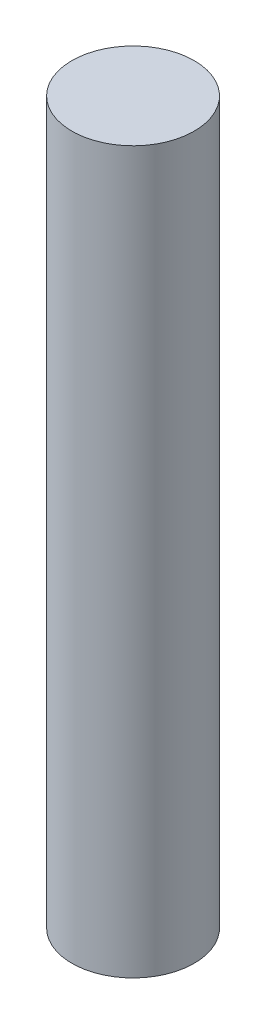
ISO-10303-21;
HEADER;
FILE_DESCRIPTION(('STEP AP214'),'2;1');
FILE_NAME('part.step','',(''),(''),'','','');
FILE_SCHEMA(('AUTOMOTIVE_DESIGN { 1 0 10303 214 1 1 1 1 }'));
ENDSEC;
DATA;
#1=APPLICATION_CONTEXT('core data for automotive mechanical design processes');
#2=APPLICATION_PROTOCOL_DEFINITION('international standard','automotive_design',2000,#1);
#3=PRODUCT_CONTEXT('',#1,'mechanical');
#4=PRODUCT('Part','Part','',(#3));
#5=PRODUCT_RELATED_PRODUCT_CATEGORY('part','',(#4));
#6=PRODUCT_DEFINITION_FORMATION('','',#4);
#7=PRODUCT_DEFINITION_CONTEXT('part definition',#1,'design');
#8=PRODUCT_DEFINITION('design','',#6,#7);
#9=PRODUCT_DEFINITION_SHAPE('','',#8);
#10=(LENGTH_UNIT() NAMED_UNIT(*) SI_UNIT(.MILLI.,.METRE.));
#11=(NAMED_UNIT(*) PLANE_ANGLE_UNIT() SI_UNIT($,.RADIAN.));
#12=(NAMED_UNIT(*) SI_UNIT($,.STERADIAN.) SOLID_ANGLE_UNIT());
#13=UNCERTAINTY_MEASURE_WITH_UNIT(LENGTH_MEASURE(1.E-05),#10,'distance_accuracy_value','');
#14=(GEOMETRIC_REPRESENTATION_CONTEXT(3) GLOBAL_UNCERTAINTY_ASSIGNED_CONTEXT((#13)) GLOBAL_UNIT_ASSIGNED_CONTEXT((#10,
#11,#12)) REPRESENTATION_CONTEXT('',''));
#15=CARTESIAN_POINT('',(0.,0.,0.));
#16=DIRECTION('',(0.,0.,1.));
#17=DIRECTION('',(1.,0.,0.));
#18=AXIS2_PLACEMENT_3D('',#15,#16,#17);
#19=CARTESIAN_POINT('',(0.,16.5,0.));
#20=DIRECTION('',(0.,-1.,0.));
#21=DIRECTION('',(0.,0.,1.));
#22=AXIS2_PLACEMENT_3D('',#19,#20,#21);
#23=CYLINDRICAL_SURFACE('',#22,1.4);
#24=CARTESIAN_POINT('',(0.,16.5,0.));
#25=DIRECTION('',(0.,-1.,0.));
#26=DIRECTION('',(0.,0.,-1.));
#27=AXIS2_PLACEMENT_3D('',#24,#25,#26);
#28=CIRCLE('',#27,1.4);
#29=CARTESIAN_POINT('',(0.,16.5,-1.4));
#30=VERTEX_POINT('',#29);
#31=EDGE_CURVE('E10',#30,#30,#28,.T.);
#32=ORIENTED_EDGE('',*,*,#31,.T.);
#33=EDGE_LOOP('',(#32));
#34=FACE_BOUND('',#33,.T.);
#35=CARTESIAN_POINT('',(0.,0.,0.));
#36=DIRECTION('',(0.,-1.,0.));
#37=DIRECTION('',(0.,0.,-1.));
#38=AXIS2_PLACEMENT_3D('',#35,#36,#37);
#39=CIRCLE('',#38,1.4);
#40=CARTESIAN_POINT('',(0.,0.,-1.4));
#41=VERTEX_POINT('',#40);
#42=EDGE_CURVE('E38',#41,#41,#39,.T.);
#43=ORIENTED_EDGE('',*,*,#42,.F.);
#44=EDGE_LOOP('',(#43));
#45=FACE_BOUND('',#44,.T.);
#46=ADVANCED_FACE('F35',(#34,#45),#23,.T.);
#47=CARTESIAN_POINT('',(0.,16.5,0.));
#48=DIRECTION('',(0.,1.,0.));
#49=DIRECTION('',(0.,0.,-1.));
#50=AXIS2_PLACEMENT_3D('',#47,#48,#49);
#51=PLANE('',#50);
#52=ORIENTED_EDGE('',*,*,#31,.F.);
#53=EDGE_LOOP('',(#52));
#54=FACE_BOUND('',#53,.T.);
#55=ADVANCED_FACE('F50',(#54),#51,.T.);
#56=CARTESIAN_POINT('',(0.,0.,0.));
#57=DIRECTION('',(0.,1.,0.));
#58=DIRECTION('',(0.,0.,-1.));
#59=AXIS2_PLACEMENT_3D('',#56,#57,#58);
#60=PLANE('',#59);
#61=ORIENTED_EDGE('',*,*,#42,.T.);
#62=EDGE_LOOP('',(#61));
#63=FACE_BOUND('',#62,.T.);
#64=ADVANCED_FACE('F47',(#63),#60,.F.);
#65=CLOSED_SHELL('',(#46,#55,#64));
#66=MANIFOLD_SOLID_BREP('B2',#65);
#67=ADVANCED_BREP_SHAPE_REPRESENTATION('',(#18,#66),#14);
#68=SHAPE_DEFINITION_REPRESENTATION(#9,#67);
ENDSEC;
END-ISO-10303-21;
